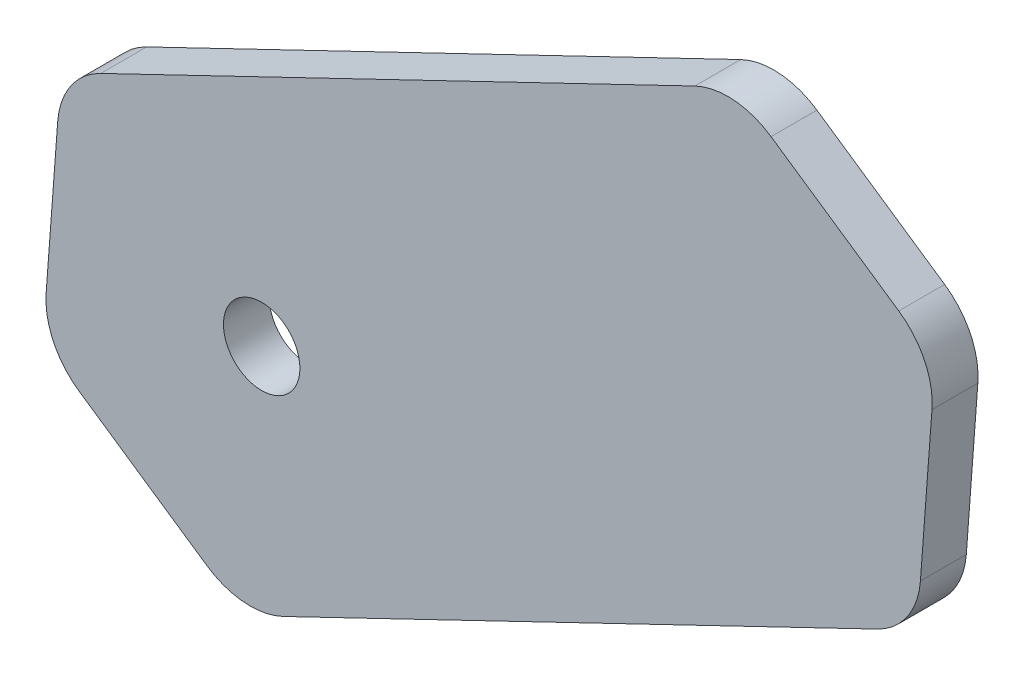
ISO-10303-21;
HEADER;
FILE_DESCRIPTION(('STEP AP214'),'2;1');
FILE_NAME('part.step','',(''),(''),'','','');
FILE_SCHEMA(('AUTOMOTIVE_DESIGN { 1 0 10303 214 1 1 1 1 }'));
ENDSEC;
DATA;
#1=APPLICATION_CONTEXT('core data for automotive mechanical design processes');
#2=APPLICATION_PROTOCOL_DEFINITION('international standard','automotive_design',2000,#1);
#3=PRODUCT_CONTEXT('',#1,'mechanical');
#4=PRODUCT('Part','Part','',(#3));
#5=PRODUCT_RELATED_PRODUCT_CATEGORY('part','',(#4));
#6=PRODUCT_DEFINITION_FORMATION('','',#4);
#7=PRODUCT_DEFINITION_CONTEXT('part definition',#1,'design');
#8=PRODUCT_DEFINITION('design','',#6,#7);
#9=PRODUCT_DEFINITION_SHAPE('','',#8);
#10=(LENGTH_UNIT() NAMED_UNIT(*) SI_UNIT(.MILLI.,.METRE.));
#11=(NAMED_UNIT(*) PLANE_ANGLE_UNIT() SI_UNIT($,.RADIAN.));
#12=(NAMED_UNIT(*) SI_UNIT($,.STERADIAN.) SOLID_ANGLE_UNIT());
#13=UNCERTAINTY_MEASURE_WITH_UNIT(LENGTH_MEASURE(1.E-05),#10,'distance_accuracy_value','');
#14=(GEOMETRIC_REPRESENTATION_CONTEXT(3) GLOBAL_UNCERTAINTY_ASSIGNED_CONTEXT((#13)) GLOBAL_UNIT_ASSIGNED_CONTEXT((#10,
#11,#12)) REPRESENTATION_CONTEXT('',''));
#15=CARTESIAN_POINT('',(0.,0.,0.));
#16=DIRECTION('',(0.,0.,1.));
#17=DIRECTION('',(1.,0.,0.));
#18=AXIS2_PLACEMENT_3D('',#15,#16,#17);
#19=CARTESIAN_POINT('',(-77.5067950194668,289.669834391254,6.));
#20=DIRECTION('',(0.,0.,-1.));
#21=DIRECTION('',(-1.,0.,0.));
#22=AXIS2_PLACEMENT_3D('',#19,#20,#21);
#23=PLANE('',#22);
#24=CARTESIAN_POINT('',(-77.5067950194668,289.669834391254,6.));
#25=DIRECTION('',(0.,0.,1.));
#26=DIRECTION('',(-1.,0.,0.));
#27=AXIS2_PLACEMENT_3D('',#24,#25,#26);
#28=CIRCLE('',#27,9.9999999999999);
#29=CARTESIAN_POINT('',(-73.167810082895,280.660216767836,6.));
#30=VERTEX_POINT('',#29);
#31=CARTESIAN_POINT('',(-67.5347448109172,288.922696761255,6.));
#32=VERTEX_POINT('',#31);
#33=EDGE_CURVE('E204',#30,#32,#28,.T.);
#34=ORIENTED_EDGE('',*,*,#33,.T.);
#35=DIRECTION('',(0.0747137629999655,0.997205020854982,0.));
#36=VECTOR('',#35,1.);
#37=CARTESIAN_POINT('',(-66.0247796606879,309.076210232734,6.));
#38=LINE('',#37,#36);
#39=CARTESIAN_POINT('',(-66.0247796606879,309.076210232734,6.));
#40=VERTEX_POINT('',#39);
#41=EDGE_CURVE('E116',#32,#40,#38,.T.);
#42=ORIENTED_EDGE('',*,*,#41,.T.);
#43=CARTESIAN_POINT('',(-75.9968298692377,309.823347862733,6.));
#44=DIRECTION('',(0.,0.,1.));
#45=DIRECTION('',(-1.,0.,0.));
#46=AXIS2_PLACEMENT_3D('',#43,#44,#45);
#47=CIRCLE('',#46,9.99999999999999);
#48=CARTESIAN_POINT('',(-70.36376459726,318.085827856152,6.));
#49=VERTEX_POINT('',#48);
#50=EDGE_CURVE('E241',#40,#49,#47,.T.);
#51=ORIENTED_EDGE('',*,*,#50,.T.);
#52=DIRECTION('',(-0.826247999341838,0.563306527197769,0.));
#53=VECTOR('',#52,1.);
#54=CARTESIAN_POINT('',(-87.0622366639585,329.470252770819,6.));
#55=LINE('',#54,#53);
#56=CARTESIAN_POINT('',(-87.0622366639585,329.470252770819,6.));
#57=VERTEX_POINT('',#56);
#58=EDGE_CURVE('E261',#49,#57,#55,.T.);
#59=ORIENTED_EDGE('',*,*,#58,.T.);
#60=CARTESIAN_POINT('',(-92.6953019359364,321.2077727774,6.));
#61=DIRECTION('',(0.,0.,1.));
#62=DIRECTION('',(-1.,0.,0.));
#63=AXIS2_PLACEMENT_3D('',#60,#61,#62);
#64=CIRCLE('',#63,9.99999999999999);
#65=CARTESIAN_POINT('',(-97.0342868725083,330.217390400818,6.));
#66=VERTEX_POINT('',#65);
#67=EDGE_CURVE('E257',#57,#66,#64,.T.);
#68=ORIENTED_EDGE('',*,*,#67,.T.);
#69=DIRECTION('',(-0.900961762341791,-0.433898493657185,0.));
#70=VECTOR('',#69,1.);
#71=CARTESIAN_POINT('',(-174.697190786371,292.815340247569,6.));
#72=LINE('',#71,#70);
#73=CARTESIAN_POINT('',(-174.697190786371,292.815340247569,6.));
#74=VERTEX_POINT('',#73);
#75=EDGE_CURVE('E260',#66,#74,#72,.T.);
#76=ORIENTED_EDGE('',*,*,#75,.T.);
#77=CARTESIAN_POINT('',(-170.358205849799,283.805722624151,6.));
#78=DIRECTION('',(0.,0.,1.));
#79=DIRECTION('',(-1.,0.,0.));
#80=AXIS2_PLACEMENT_3D('',#77,#78,#79);
#81=CIRCLE('',#80,10.);
#82=CARTESIAN_POINT('',(-180.330256058349,284.552860254151,6.));
#83=VERTEX_POINT('',#82);
#84=EDGE_CURVE('E265',#74,#83,#81,.T.);
#85=ORIENTED_EDGE('',*,*,#84,.T.);
#86=DIRECTION('',(-0.074713762999944,-0.997205020854984,0.));
#87=VECTOR('',#86,1.);
#88=CARTESIAN_POINT('',(-181.840221208577,264.399346782671,6.));
#89=LINE('',#88,#87);
#90=CARTESIAN_POINT('',(-181.840221208577,264.399346782671,6.));
#91=VERTEX_POINT('',#90);
#92=EDGE_CURVE('E272',#83,#91,#89,.T.);
#93=ORIENTED_EDGE('',*,*,#92,.T.);
#94=CARTESIAN_POINT('',(-171.868171000028,263.652209152672,6.));
#95=DIRECTION('',(0.,0.,1.));
#96=DIRECTION('',(-1.,0.,0.));
#97=AXIS2_PLACEMENT_3D('',#94,#95,#96);
#98=CIRCLE('',#97,9.99999999999993);
#99=CARTESIAN_POINT('',(-177.501236272005,255.389729159254,6.));
#100=VERTEX_POINT('',#99);
#101=EDGE_CURVE('E147',#91,#100,#98,.T.);
#102=ORIENTED_EDGE('',*,*,#101,.T.);
#103=DIRECTION('',(0.826247999341828,-0.563306527197784,0.));
#104=VECTOR('',#103,1.);
#105=CARTESIAN_POINT('',(-160.802764205307,244.005304244587,6.));
#106=LINE('',#105,#104);
#107=CARTESIAN_POINT('',(-160.802764205307,244.005304244587,6.));
#108=VERTEX_POINT('',#107);
#109=EDGE_CURVE('E141',#100,#108,#106,.T.);
#110=ORIENTED_EDGE('',*,*,#109,.T.);
#111=CARTESIAN_POINT('',(-155.169698933329,252.267784238005,6.));
#112=DIRECTION('',(0.,0.,1.));
#113=DIRECTION('',(-1.,0.,0.));
#114=AXIS2_PLACEMENT_3D('',#111,#112,#113);
#115=CIRCLE('',#114,10.);
#116=CARTESIAN_POINT('',(-150.830713996757,243.258166614587,6.));
#117=VERTEX_POINT('',#116);
#118=EDGE_CURVE('E145',#108,#117,#115,.T.);
#119=ORIENTED_EDGE('',*,*,#118,.T.);
#120=DIRECTION('',(0.90096176234179,0.433898493657186,0.));
#121=VECTOR('',#120,1.);
#122=CARTESIAN_POINT('',(-73.167810082895,280.660216767836,6.));
#123=LINE('',#122,#121);
#124=EDGE_CURVE('E61',#117,#30,#123,.T.);
#125=ORIENTED_EDGE('',*,*,#124,.T.);
#126=EDGE_LOOP('',(#34,#42,#51,#59,#68,#76,#85,#93,#102,#110,#119,#125));
#127=FACE_BOUND('',#126,.T.);
#128=CARTESIAN_POINT('',(-153.660763686332,272.423436021123,6.));
#129=DIRECTION('',(0.,0.,1.));
#130=DIRECTION('',(1.,0.,0.));
#131=AXIS2_PLACEMENT_3D('',#128,#129,#130);
#132=CIRCLE('',#131,5.00000000000003);
#133=CARTESIAN_POINT('',(-148.660763686332,272.423436021123,6.));
#134=VERTEX_POINT('',#133);
#135=EDGE_CURVE('E174',#134,#134,#132,.T.);
#136=ORIENTED_EDGE('',*,*,#135,.F.);
#137=EDGE_LOOP('',(#136));
#138=FACE_BOUND('',#137,.T.);
#139=ADVANCED_FACE('F43',(#127,#138),#23,.F.);
#140=CARTESIAN_POINT('',(-77.5067950194668,289.669834391254,0.));
#141=DIRECTION('',(0.,0.,-1.));
#142=DIRECTION('',(-1.,0.,0.));
#143=AXIS2_PLACEMENT_3D('',#140,#141,#142);
#144=PLANE('',#143);
#145=CARTESIAN_POINT('',(-77.5067950194668,289.669834391254,0.));
#146=DIRECTION('',(0.,0.,1.));
#147=DIRECTION('',(-1.,0.,0.));
#148=AXIS2_PLACEMENT_3D('',#145,#146,#147);
#149=CIRCLE('',#148,9.9999999999999);
#150=CARTESIAN_POINT('',(-73.167810082895,280.660216767836,0.));
#151=VERTEX_POINT('',#150);
#152=CARTESIAN_POINT('',(-67.5347448109172,288.922696761255,0.));
#153=VERTEX_POINT('',#152);
#154=EDGE_CURVE('E169',#151,#153,#149,.T.);
#155=ORIENTED_EDGE('',*,*,#154,.F.);
#156=DIRECTION('',(0.90096176234179,0.433898493657186,0.));
#157=VECTOR('',#156,1.);
#158=CARTESIAN_POINT('',(-73.167810082895,280.660216767836,0.));
#159=LINE('',#158,#157);
#160=CARTESIAN_POINT('',(-150.830713996757,243.258166614587,0.));
#161=VERTEX_POINT('',#160);
#162=EDGE_CURVE('E108',#161,#151,#159,.T.);
#163=ORIENTED_EDGE('',*,*,#162,.F.);
#164=CARTESIAN_POINT('',(-155.169698933329,252.267784238005,0.));
#165=DIRECTION('',(0.,0.,1.));
#166=DIRECTION('',(-1.,0.,0.));
#167=AXIS2_PLACEMENT_3D('',#164,#165,#166);
#168=CIRCLE('',#167,10.);
#169=CARTESIAN_POINT('',(-160.802764205307,244.005304244587,0.));
#170=VERTEX_POINT('',#169);
#171=EDGE_CURVE('E102',#170,#161,#168,.T.);
#172=ORIENTED_EDGE('',*,*,#171,.F.);
#173=DIRECTION('',(0.826247999341828,-0.563306527197784,0.));
#174=VECTOR('',#173,1.);
#175=CARTESIAN_POINT('',(-160.802764205307,244.005304244587,0.));
#176=LINE('',#175,#174);
#177=CARTESIAN_POINT('',(-177.501236272005,255.389729159254,0.));
#178=VERTEX_POINT('',#177);
#179=EDGE_CURVE('E156',#178,#170,#176,.T.);
#180=ORIENTED_EDGE('',*,*,#179,.F.);
#181=CARTESIAN_POINT('',(-171.868171000028,263.652209152672,0.));
#182=DIRECTION('',(0.,0.,1.));
#183=DIRECTION('',(-1.,0.,0.));
#184=AXIS2_PLACEMENT_3D('',#181,#182,#183);
#185=CIRCLE('',#184,9.99999999999993);
#186=CARTESIAN_POINT('',(-181.840221208577,264.399346782671,0.));
#187=VERTEX_POINT('',#186);
#188=EDGE_CURVE('E195',#187,#178,#185,.T.);
#189=ORIENTED_EDGE('',*,*,#188,.F.);
#190=DIRECTION('',(-0.074713762999944,-0.997205020854984,0.));
#191=VECTOR('',#190,1.);
#192=CARTESIAN_POINT('',(-181.840221208577,264.399346782671,0.));
#193=LINE('',#192,#191);
#194=CARTESIAN_POINT('',(-180.330256058349,284.552860254151,0.));
#195=VERTEX_POINT('',#194);
#196=EDGE_CURVE('E192',#195,#187,#193,.T.);
#197=ORIENTED_EDGE('',*,*,#196,.F.);
#198=CARTESIAN_POINT('',(-170.358205849799,283.805722624151,0.));
#199=DIRECTION('',(0.,0.,1.));
#200=DIRECTION('',(-1.,0.,0.));
#201=AXIS2_PLACEMENT_3D('',#198,#199,#200);
#202=CIRCLE('',#201,10.);
#203=CARTESIAN_POINT('',(-174.697190786371,292.815340247569,0.));
#204=VERTEX_POINT('',#203);
#205=EDGE_CURVE('E189',#204,#195,#202,.T.);
#206=ORIENTED_EDGE('',*,*,#205,.F.);
#207=DIRECTION('',(-0.900961762341791,-0.433898493657185,0.));
#208=VECTOR('',#207,1.);
#209=CARTESIAN_POINT('',(-174.697190786371,292.815340247569,0.));
#210=LINE('',#209,#208);
#211=CARTESIAN_POINT('',(-97.0342868725083,330.217390400818,0.));
#212=VERTEX_POINT('',#211);
#213=EDGE_CURVE('E186',#212,#204,#210,.T.);
#214=ORIENTED_EDGE('',*,*,#213,.F.);
#215=CARTESIAN_POINT('',(-92.6953019359364,321.2077727774,0.));
#216=DIRECTION('',(0.,0.,1.));
#217=DIRECTION('',(-1.,0.,0.));
#218=AXIS2_PLACEMENT_3D('',#215,#216,#217);
#219=CIRCLE('',#218,9.99999999999999);
#220=CARTESIAN_POINT('',(-87.0622366639585,329.470252770819,0.));
#221=VERTEX_POINT('',#220);
#222=EDGE_CURVE('E183',#221,#212,#219,.T.);
#223=ORIENTED_EDGE('',*,*,#222,.F.);
#224=DIRECTION('',(-0.826247999341838,0.563306527197769,0.));
#225=VECTOR('',#224,1.);
#226=CARTESIAN_POINT('',(-87.0622366639585,329.470252770819,0.));
#227=LINE('',#226,#225);
#228=CARTESIAN_POINT('',(-70.36376459726,318.085827856152,0.));
#229=VERTEX_POINT('',#228);
#230=EDGE_CURVE('E180',#229,#221,#227,.T.);
#231=ORIENTED_EDGE('',*,*,#230,.F.);
#232=CARTESIAN_POINT('',(-75.9968298692377,309.823347862733,0.));
#233=DIRECTION('',(0.,0.,1.));
#234=DIRECTION('',(-1.,0.,0.));
#235=AXIS2_PLACEMENT_3D('',#232,#233,#234);
#236=CIRCLE('',#235,9.99999999999999);
#237=CARTESIAN_POINT('',(-66.0247796606879,309.076210232734,0.));
#238=VERTEX_POINT('',#237);
#239=EDGE_CURVE('E177',#238,#229,#236,.T.);
#240=ORIENTED_EDGE('',*,*,#239,.F.);
#241=DIRECTION('',(0.0747137629999655,0.997205020854982,0.));
#242=VECTOR('',#241,1.);
#243=CARTESIAN_POINT('',(-66.0247796606879,309.076210232734,0.));
#244=LINE('',#243,#242);
#245=EDGE_CURVE('E173',#153,#238,#244,.T.);
#246=ORIENTED_EDGE('',*,*,#245,.F.);
#247=EDGE_LOOP('',(#155,#163,#172,#180,#189,#197,#206,#214,#223,#231,#240,#246));
#248=FACE_BOUND('',#247,.T.);
#249=CARTESIAN_POINT('',(-153.660763686332,272.423436021123,0.));
#250=DIRECTION('',(0.,0.,1.));
#251=DIRECTION('',(1.,0.,0.));
#252=AXIS2_PLACEMENT_3D('',#249,#250,#251);
#253=CIRCLE('',#252,5.00000000000003);
#254=CARTESIAN_POINT('',(-148.660763686332,272.423436021123,0.));
#255=VERTEX_POINT('',#254);
#256=EDGE_CURVE('E451',#255,#255,#253,.T.);
#257=ORIENTED_EDGE('',*,*,#256,.T.);
#258=EDGE_LOOP('',(#257));
#259=FACE_BOUND('',#258,.T.);
#260=ADVANCED_FACE('F245',(#248,#259),#144,.T.);
#261=CARTESIAN_POINT('',(-77.5067950194668,289.669834391254,6.));
#262=DIRECTION('',(0.,0.,-1.));
#263=DIRECTION('',(-1.,0.,0.));
#264=AXIS2_PLACEMENT_3D('',#261,#262,#263);
#265=CYLINDRICAL_SURFACE('',#264,9.9999999999999);
#266=ORIENTED_EDGE('',*,*,#154,.T.);
#267=DIRECTION('',(0.,0.,-1.));
#268=VECTOR('',#267,1.);
#269=CARTESIAN_POINT('',(-67.5347448109172,288.922696761255,6.));
#270=LINE('',#269,#268);
#271=EDGE_CURVE('E11',#32,#153,#270,.T.);
#272=ORIENTED_EDGE('',*,*,#271,.F.);
#273=ORIENTED_EDGE('',*,*,#33,.F.);
#274=DIRECTION('',(0.,0.,-1.));
#275=VECTOR('',#274,1.);
#276=CARTESIAN_POINT('',(-73.167810082895,280.660216767836,6.));
#277=LINE('',#276,#275);
#278=EDGE_CURVE('E165',#30,#151,#277,.T.);
#279=ORIENTED_EDGE('',*,*,#278,.T.);
#280=EDGE_LOOP('',(#266,#272,#273,#279));
#281=FACE_BOUND('',#280,.T.);
#282=ADVANCED_FACE('F45',(#281),#265,.T.);
#283=CARTESIAN_POINT('',(-66.0247796606879,309.076210232734,6.));
#284=DIRECTION('',(-0.997205020854982,0.0747137629999655,0.));
#285=DIRECTION('',(-0.0747137629999655,-0.997205020854982,0.));
#286=AXIS2_PLACEMENT_3D('',#283,#284,#285);
#287=PLANE('',#286);
#288=ORIENTED_EDGE('',*,*,#245,.T.);
#289=DIRECTION('',(0.,0.,-1.));
#290=VECTOR('',#289,1.);
#291=CARTESIAN_POINT('',(-66.0247796606879,309.076210232734,6.));
#292=LINE('',#291,#290);
#293=EDGE_CURVE('E53',#40,#238,#292,.T.);
#294=ORIENTED_EDGE('',*,*,#293,.F.);
#295=ORIENTED_EDGE('',*,*,#41,.F.);
#296=ORIENTED_EDGE('',*,*,#271,.T.);
#297=EDGE_LOOP('',(#288,#294,#295,#296));
#298=FACE_BOUND('',#297,.T.);
#299=ADVANCED_FACE('F308',(#298),#287,.F.);
#300=CARTESIAN_POINT('',(-75.9968298692377,309.823347862733,6.));
#301=DIRECTION('',(0.,0.,-1.));
#302=DIRECTION('',(-1.,0.,0.));
#303=AXIS2_PLACEMENT_3D('',#300,#301,#302);
#304=CYLINDRICAL_SURFACE('',#303,9.99999999999999);
#305=ORIENTED_EDGE('',*,*,#239,.T.);
#306=DIRECTION('',(0.,0.,-1.));
#307=VECTOR('',#306,1.);
#308=CARTESIAN_POINT('',(-70.36376459726,318.085827856152,6.));
#309=LINE('',#308,#307);
#310=EDGE_CURVE('E231',#49,#229,#309,.T.);
#311=ORIENTED_EDGE('',*,*,#310,.F.);
#312=ORIENTED_EDGE('',*,*,#50,.F.);
#313=ORIENTED_EDGE('',*,*,#293,.T.);
#314=EDGE_LOOP('',(#305,#311,#312,#313));
#315=FACE_BOUND('',#314,.T.);
#316=ADVANCED_FACE('F239',(#315),#304,.T.);
#317=CARTESIAN_POINT('',(-87.0622366639585,329.470252770819,6.));
#318=DIRECTION('',(-0.563306527197769,-0.826247999341838,0.));
#319=DIRECTION('',(0.826247999341838,-0.563306527197769,0.));
#320=AXIS2_PLACEMENT_3D('',#317,#318,#319);
#321=PLANE('',#320);
#322=ORIENTED_EDGE('',*,*,#230,.T.);
#323=DIRECTION('',(0.,0.,-1.));
#324=VECTOR('',#323,1.);
#325=CARTESIAN_POINT('',(-87.0622366639585,329.470252770819,6.));
#326=LINE('',#325,#324);
#327=EDGE_CURVE('E227',#57,#221,#326,.T.);
#328=ORIENTED_EDGE('',*,*,#327,.F.);
#329=ORIENTED_EDGE('',*,*,#58,.F.);
#330=ORIENTED_EDGE('',*,*,#310,.T.);
#331=EDGE_LOOP('',(#322,#328,#329,#330));
#332=FACE_BOUND('',#331,.T.);
#333=ADVANCED_FACE('F251',(#332),#321,.F.);
#334=CARTESIAN_POINT('',(-92.6953019359364,321.2077727774,6.));
#335=DIRECTION('',(0.,0.,-1.));
#336=DIRECTION('',(-1.,0.,0.));
#337=AXIS2_PLACEMENT_3D('',#334,#335,#336);
#338=CYLINDRICAL_SURFACE('',#337,9.99999999999999);
#339=ORIENTED_EDGE('',*,*,#222,.T.);
#340=DIRECTION('',(0.,0.,-1.));
#341=VECTOR('',#340,1.);
#342=CARTESIAN_POINT('',(-97.0342868725083,330.217390400818,6.));
#343=LINE('',#342,#341);
#344=EDGE_CURVE('E223',#66,#212,#343,.T.);
#345=ORIENTED_EDGE('',*,*,#344,.F.);
#346=ORIENTED_EDGE('',*,*,#67,.F.);
#347=ORIENTED_EDGE('',*,*,#327,.T.);
#348=EDGE_LOOP('',(#339,#345,#346,#347));
#349=FACE_BOUND('',#348,.T.);
#350=ADVANCED_FACE('F255',(#349),#338,.T.);
#351=CARTESIAN_POINT('',(-174.697190786371,292.815340247569,6.));
#352=DIRECTION('',(0.433898493657185,-0.900961762341791,0.));
#353=DIRECTION('',(0.900961762341791,0.433898493657185,0.));
#354=AXIS2_PLACEMENT_3D('',#351,#352,#353);
#355=PLANE('',#354);
#356=ORIENTED_EDGE('',*,*,#213,.T.);
#357=DIRECTION('',(0.,0.,-1.));
#358=VECTOR('',#357,1.);
#359=CARTESIAN_POINT('',(-174.697190786371,292.815340247569,6.));
#360=LINE('',#359,#358);
#361=EDGE_CURVE('E219',#74,#204,#360,.T.);
#362=ORIENTED_EDGE('',*,*,#361,.F.);
#363=ORIENTED_EDGE('',*,*,#75,.F.);
#364=ORIENTED_EDGE('',*,*,#344,.T.);
#365=EDGE_LOOP('',(#356,#362,#363,#364));
#366=FACE_BOUND('',#365,.T.);
#367=ADVANCED_FACE('F321',(#366),#355,.F.);
#368=CARTESIAN_POINT('',(-170.358205849799,283.805722624151,6.));
#369=DIRECTION('',(0.,0.,-1.));
#370=DIRECTION('',(-1.,0.,0.));
#371=AXIS2_PLACEMENT_3D('',#368,#369,#370);
#372=CYLINDRICAL_SURFACE('',#371,10.);
#373=ORIENTED_EDGE('',*,*,#205,.T.);
#374=DIRECTION('',(0.,0.,-1.));
#375=VECTOR('',#374,1.);
#376=CARTESIAN_POINT('',(-180.330256058349,284.552860254151,6.));
#377=LINE('',#376,#375);
#378=EDGE_CURVE('E215',#83,#195,#377,.T.);
#379=ORIENTED_EDGE('',*,*,#378,.F.);
#380=ORIENTED_EDGE('',*,*,#84,.F.);
#381=ORIENTED_EDGE('',*,*,#361,.T.);
#382=EDGE_LOOP('',(#373,#379,#380,#381));
#383=FACE_BOUND('',#382,.T.);
#384=ADVANCED_FACE('F324',(#383),#372,.T.);
#385=CARTESIAN_POINT('',(-181.840221208577,264.399346782671,6.));
#386=DIRECTION('',(0.997205020854984,-0.074713762999944,0.));
#387=DIRECTION('',(0.074713762999944,0.997205020854984,0.));
#388=AXIS2_PLACEMENT_3D('',#385,#386,#387);
#389=PLANE('',#388);
#390=ORIENTED_EDGE('',*,*,#196,.T.);
#391=DIRECTION('',(0.,0.,-1.));
#392=VECTOR('',#391,1.);
#393=CARTESIAN_POINT('',(-181.840221208577,264.399346782671,6.));
#394=LINE('',#393,#392);
#395=EDGE_CURVE('E211',#91,#187,#394,.T.);
#396=ORIENTED_EDGE('',*,*,#395,.F.);
#397=ORIENTED_EDGE('',*,*,#92,.F.);
#398=ORIENTED_EDGE('',*,*,#378,.T.);
#399=EDGE_LOOP('',(#390,#396,#397,#398));
#400=FACE_BOUND('',#399,.T.);
#401=ADVANCED_FACE('F280',(#400),#389,.F.);
#402=CARTESIAN_POINT('',(-171.868171000028,263.652209152672,6.));
#403=DIRECTION('',(0.,0.,-1.));
#404=DIRECTION('',(-1.,0.,0.));
#405=AXIS2_PLACEMENT_3D('',#402,#403,#404);
#406=CYLINDRICAL_SURFACE('',#405,9.99999999999993);
#407=ORIENTED_EDGE('',*,*,#188,.T.);
#408=DIRECTION('',(0.,0.,-1.));
#409=VECTOR('',#408,1.);
#410=CARTESIAN_POINT('',(-177.501236272005,255.389729159254,6.));
#411=LINE('',#410,#409);
#412=EDGE_CURVE('E158',#100,#178,#411,.T.);
#413=ORIENTED_EDGE('',*,*,#412,.F.);
#414=ORIENTED_EDGE('',*,*,#101,.F.);
#415=ORIENTED_EDGE('',*,*,#395,.T.);
#416=EDGE_LOOP('',(#407,#413,#414,#415));
#417=FACE_BOUND('',#416,.T.);
#418=ADVANCED_FACE('F284',(#417),#406,.T.);
#419=CARTESIAN_POINT('',(-160.802764205307,244.005304244587,6.));
#420=DIRECTION('',(0.563306527197784,0.826247999341827,0.));
#421=DIRECTION('',(-0.826247999341828,0.563306527197784,0.));
#422=AXIS2_PLACEMENT_3D('',#419,#420,#421);
#423=PLANE('',#422);
#424=ORIENTED_EDGE('',*,*,#179,.T.);
#425=DIRECTION('',(0.,0.,-1.));
#426=VECTOR('',#425,1.);
#427=CARTESIAN_POINT('',(-160.802764205307,244.005304244587,6.));
#428=LINE('',#427,#426);
#429=EDGE_CURVE('E153',#108,#170,#428,.T.);
#430=ORIENTED_EDGE('',*,*,#429,.F.);
#431=ORIENTED_EDGE('',*,*,#109,.F.);
#432=ORIENTED_EDGE('',*,*,#412,.T.);
#433=EDGE_LOOP('',(#424,#430,#431,#432));
#434=FACE_BOUND('',#433,.T.);
#435=ADVANCED_FACE('F154',(#434),#423,.F.);
#436=CARTESIAN_POINT('',(-155.169698933329,252.267784238005,6.));
#437=DIRECTION('',(0.,0.,-1.));
#438=DIRECTION('',(-1.,0.,0.));
#439=AXIS2_PLACEMENT_3D('',#436,#437,#438);
#440=CYLINDRICAL_SURFACE('',#439,10.);
#441=ORIENTED_EDGE('',*,*,#171,.T.);
#442=DIRECTION('',(0.,0.,-1.));
#443=VECTOR('',#442,1.);
#444=CARTESIAN_POINT('',(-150.830713996757,243.258166614587,6.));
#445=LINE('',#444,#443);
#446=EDGE_CURVE('E159',#117,#161,#445,.T.);
#447=ORIENTED_EDGE('',*,*,#446,.F.);
#448=ORIENTED_EDGE('',*,*,#118,.F.);
#449=ORIENTED_EDGE('',*,*,#429,.T.);
#450=EDGE_LOOP('',(#441,#447,#448,#449));
#451=FACE_BOUND('',#450,.T.);
#452=ADVANCED_FACE('F161',(#451),#440,.T.);
#453=CARTESIAN_POINT('',(-73.167810082895,280.660216767836,6.));
#454=DIRECTION('',(-0.433898493657186,0.90096176234179,0.));
#455=DIRECTION('',(-0.900961762341791,-0.433898493657186,0.));
#456=AXIS2_PLACEMENT_3D('',#453,#454,#455);
#457=PLANE('',#456);
#458=ORIENTED_EDGE('',*,*,#162,.T.);
#459=ORIENTED_EDGE('',*,*,#278,.F.);
#460=ORIENTED_EDGE('',*,*,#124,.F.);
#461=ORIENTED_EDGE('',*,*,#446,.T.);
#462=EDGE_LOOP('',(#458,#459,#460,#461));
#463=FACE_BOUND('',#462,.T.);
#464=ADVANCED_FACE('F288',(#463),#457,.F.);
#465=CARTESIAN_POINT('',(-153.660763686332,272.423436021123,6.));
#466=DIRECTION('',(0.,0.,-1.));
#467=DIRECTION('',(-1.,0.,0.));
#468=AXIS2_PLACEMENT_3D('',#465,#466,#467);
#469=CYLINDRICAL_SURFACE('',#468,5.00000000000003);
#470=ORIENTED_EDGE('',*,*,#135,.T.);
#471=EDGE_LOOP('',(#470));
#472=FACE_BOUND('',#471,.T.);
#473=ORIENTED_EDGE('',*,*,#256,.F.);
#474=EDGE_LOOP('',(#473));
#475=FACE_BOUND('',#474,.T.);
#476=ADVANCED_FACE('F290',(#472,#475),#469,.F.);
#477=CLOSED_SHELL('',(#139,#260,#282,#299,#316,#333,#350,#367,#384,#401,#418,#435,#452,#464,#476));
#478=MANIFOLD_SOLID_BREP('B2',#477);
#479=ADVANCED_BREP_SHAPE_REPRESENTATION('',(#18,#478),#14);
#480=SHAPE_DEFINITION_REPRESENTATION(#9,#479);
ENDSEC;
END-ISO-10303-21;
